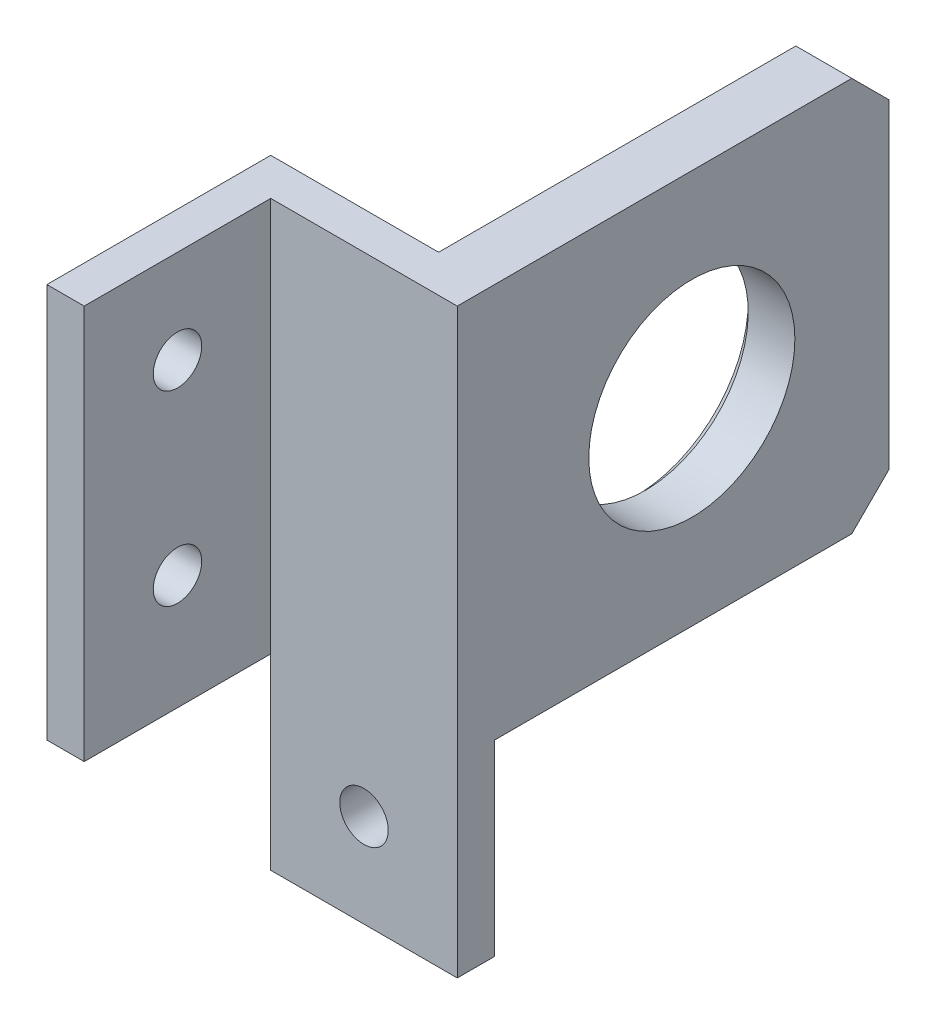
ISO-10303-21;
HEADER;
FILE_DESCRIPTION(('STEP AP214'),'2;1');
FILE_NAME('part.step','',(''),(''),'','','');
FILE_SCHEMA(('AUTOMOTIVE_DESIGN { 1 0 10303 214 1 1 1 1 }'));
ENDSEC;
DATA;
#1=APPLICATION_CONTEXT('core data for automotive mechanical design processes');
#2=APPLICATION_PROTOCOL_DEFINITION('international standard','automotive_design',2000,#1);
#3=PRODUCT_CONTEXT('',#1,'mechanical');
#4=PRODUCT('Part','Part','',(#3));
#5=PRODUCT_RELATED_PRODUCT_CATEGORY('part','',(#4));
#6=PRODUCT_DEFINITION_FORMATION('','',#4);
#7=PRODUCT_DEFINITION_CONTEXT('part definition',#1,'design');
#8=PRODUCT_DEFINITION('design','',#6,#7);
#9=PRODUCT_DEFINITION_SHAPE('','',#8);
#10=(LENGTH_UNIT() NAMED_UNIT(*) SI_UNIT(.MILLI.,.METRE.));
#11=(NAMED_UNIT(*) PLANE_ANGLE_UNIT() SI_UNIT($,.RADIAN.));
#12=(NAMED_UNIT(*) SI_UNIT($,.STERADIAN.) SOLID_ANGLE_UNIT());
#13=UNCERTAINTY_MEASURE_WITH_UNIT(LENGTH_MEASURE(1.E-05),#10,'distance_accuracy_value','');
#14=(GEOMETRIC_REPRESENTATION_CONTEXT(3) GLOBAL_UNCERTAINTY_ASSIGNED_CONTEXT((#13)) GLOBAL_UNIT_ASSIGNED_CONTEXT((#10,
#11,#12)) REPRESENTATION_CONTEXT('',''));
#15=CARTESIAN_POINT('',(0.,0.,0.));
#16=DIRECTION('',(0.,0.,1.));
#17=DIRECTION('',(1.,0.,0.));
#18=AXIS2_PLACEMENT_3D('',#15,#16,#17);
#19=CARTESIAN_POINT('',(-4.52428779759901,-82.2999999999999,-44.0000000000001));
#20=DIRECTION('',(0.,1.,0.));
#21=DIRECTION('',(-1.,0.,0.));
#22=AXIS2_PLACEMENT_3D('',#19,#20,#21);
#23=PLANE('',#22);
#24=DIRECTION('',(0.,0.,1.));
#25=VECTOR('',#24,1.);
#26=CARTESIAN_POINT('',(-24.5242877975988,-82.2999999999999,-40.0000000000001));
#27=LINE('',#26,#25);
#28=CARTESIAN_POINT('',(-24.5242877975988,-82.2999999999999,-44.0000000000001));
#29=VERTEX_POINT('',#28);
#30=CARTESIAN_POINT('',(-24.5242877975988,-82.2999999999999,-40.0000000000001));
#31=VERTEX_POINT('',#30);
#32=EDGE_CURVE('E238',#29,#31,#27,.T.);
#33=ORIENTED_EDGE('',*,*,#32,.T.);
#34=DIRECTION('',(0.,0.,-1.));
#35=VECTOR('',#34,1.);
#36=CARTESIAN_POINT('',(-24.5242877975988,-82.2999999999999,-44.0000000000001));
#37=LINE('',#36,#35);
#38=CARTESIAN_POINT('',(-24.5242877975988,-82.2999999999999,-20.0000000000001));
#39=VERTEX_POINT('',#38);
#40=EDGE_CURVE('E158',#39,#31,#37,.T.);
#41=ORIENTED_EDGE('',*,*,#40,.F.);
#42=DIRECTION('',(1.,0.,0.));
#43=VECTOR('',#42,1.);
#44=CARTESIAN_POINT('',(-28.5242877975988,-82.2999999999999,-20.0000000000001));
#45=LINE('',#44,#43);
#46=CARTESIAN_POINT('',(-28.5242877975988,-82.2999999999999,-20.0000000000001));
#47=VERTEX_POINT('',#46);
#48=EDGE_CURVE('E166',#47,#39,#45,.T.);
#49=ORIENTED_EDGE('',*,*,#48,.F.);
#50=DIRECTION('',(0.,0.,-1.));
#51=VECTOR('',#50,1.);
#52=CARTESIAN_POINT('',(-28.5242877975988,-82.2999999999999,-44.0000000000001));
#53=LINE('',#52,#51);
#54=CARTESIAN_POINT('',(-28.5242877975988,-82.2999999999999,-44.0000000000001));
#55=VERTEX_POINT('',#54);
#56=EDGE_CURVE('E163',#47,#55,#53,.T.);
#57=ORIENTED_EDGE('',*,*,#56,.T.);
#58=DIRECTION('',(1.,0.,0.));
#59=VECTOR('',#58,1.);
#60=CARTESIAN_POINT('',(-4.52428779759901,-82.2999999999999,-44.0000000000001));
#61=LINE('',#60,#59);
#62=EDGE_CURVE('E183',#55,#29,#61,.T.);
#63=ORIENTED_EDGE('',*,*,#62,.T.);
#64=EDGE_LOOP('',(#33,#41,#49,#57,#63));
#65=FACE_BOUND('',#64,.T.);
#66=ADVANCED_FACE('F33',(#65),#23,.F.);
#67=DIRECTION('',(0.,0.,1.));
#68=VECTOR('',#67,1.);
#69=CARTESIAN_POINT('',(-4.52428779759901,-82.2999999999999,-44.0000000000001));
#70=LINE('',#69,#68);
#71=CARTESIAN_POINT('',(-4.52428779759902,-82.2999999999999,-82.3000000000004));
#72=VERTEX_POINT('',#71);
#73=CARTESIAN_POINT('',(-4.52428779759901,-82.2999999999999,-44.0000000000001));
#74=VERTEX_POINT('',#73);
#75=EDGE_CURVE('E187',#72,#74,#70,.T.);
#76=ORIENTED_EDGE('',*,*,#75,.T.);
#77=DIRECTION('',(-1.,0.,0.));
#78=VECTOR('',#77,1.);
#79=CARTESIAN_POINT('',(-4.52428779759901,-82.2999999999999,-44.0000000000001));
#80=LINE('',#79,#78);
#81=CARTESIAN_POINT('',(-10.524287797599,-82.2999999999999,-44.0000000000001));
#82=VERTEX_POINT('',#81);
#83=EDGE_CURVE('E241',#74,#82,#80,.T.);
#84=ORIENTED_EDGE('',*,*,#83,.T.);
#85=DIRECTION('',(0.,0.,1.));
#86=VECTOR('',#85,1.);
#87=CARTESIAN_POINT('',(-10.524287797599,-82.2999999999999,-129.023412785029));
#88=LINE('',#87,#86);
#89=CARTESIAN_POINT('',(-10.524287797599,-82.2999999999999,-82.3000000000004));
#90=VERTEX_POINT('',#89);
#91=EDGE_CURVE('E146',#90,#82,#88,.T.);
#92=ORIENTED_EDGE('',*,*,#91,.F.);
#93=DIRECTION('',(-1.,0.,0.));
#94=VECTOR('',#93,1.);
#95=CARTESIAN_POINT('',(69.475712202401,-82.2999999999999,-82.3000000000004));
#96=LINE('',#95,#94);
#97=EDGE_CURVE('E128',#72,#90,#96,.T.);
#98=ORIENTED_EDGE('',*,*,#97,.F.);
#99=EDGE_LOOP('',(#76,#84,#92,#98));
#100=FACE_BOUND('',#99,.T.);
#101=ADVANCED_FACE('F262',(#100),#23,.F.);
#102=CARTESIAN_POINT('',(0.,0.,-44.0000000000001));
#103=DIRECTION('',(0.,0.,1.));
#104=DIRECTION('',(-1.,0.,0.));
#105=AXIS2_PLACEMENT_3D('',#102,#103,#104);
#106=PLANE('',#105);
#107=CARTESIAN_POINT('',(-14.524287797599,-92.3915967434677,-44.0000000000001));
#108=DIRECTION('',(0.,0.,1.));
#109=DIRECTION('',(1.,0.,0.));
#110=AXIS2_PLACEMENT_3D('',#107,#108,#109);
#111=CIRCLE('',#110,2.6);
#112=CARTESIAN_POINT('',(-11.924287797599,-92.3915967434677,-44.0000000000001));
#113=VERTEX_POINT('',#112);
#114=EDGE_CURVE('E251',#113,#113,#111,.T.);
#115=ORIENTED_EDGE('',*,*,#114,.T.);
#116=EDGE_LOOP('',(#115));
#117=FACE_BOUND('',#116,.T.);
#118=DIRECTION('',(0.,-1.,0.));
#119=VECTOR('',#118,1.);
#120=CARTESIAN_POINT('',(-10.524287797599,-40.,-44.0000000000001));
#121=LINE('',#120,#119);
#122=CARTESIAN_POINT('',(-10.524287797599,-40.,-44.0000000000001));
#123=VERTEX_POINT('',#122);
#124=EDGE_CURVE('E143',#123,#82,#121,.T.);
#125=ORIENTED_EDGE('',*,*,#124,.T.);
#126=ORIENTED_EDGE('',*,*,#83,.F.);
#127=DIRECTION('',(0.,1.,0.));
#128=VECTOR('',#127,1.);
#129=CARTESIAN_POINT('',(-4.52428779759904,-122.787674797839,-44.0000000000001));
#130=LINE('',#129,#128);
#131=CARTESIAN_POINT('',(-4.52428779759901,-102.391596743468,-44.0000000000001));
#132=VERTEX_POINT('',#131);
#133=EDGE_CURVE('E232',#132,#74,#130,.T.);
#134=ORIENTED_EDGE('',*,*,#133,.F.);
#135=DIRECTION('',(1.,0.,0.));
#136=VECTOR('',#135,1.);
#137=CARTESIAN_POINT('',(-4.52428779759903,-102.391596743468,-44.0000000000001));
#138=LINE('',#137,#136);
#139=CARTESIAN_POINT('',(-24.5242877975988,-102.391596743468,-44.0000000000001));
#140=VERTEX_POINT('',#139);
#141=EDGE_CURVE('E247',#140,#132,#138,.T.);
#142=ORIENTED_EDGE('',*,*,#141,.F.);
#143=DIRECTION('',(0.,1.,0.));
#144=VECTOR('',#143,1.);
#145=CARTESIAN_POINT('',(-24.5242877975989,-122.787674797839,-44.0000000000001));
#146=LINE('',#145,#144);
#147=EDGE_CURVE('E234',#140,#29,#146,.T.);
#148=ORIENTED_EDGE('',*,*,#147,.T.);
#149=ORIENTED_EDGE('',*,*,#62,.F.);
#150=DIRECTION('',(0.,1.,0.));
#151=VECTOR('',#150,1.);
#152=CARTESIAN_POINT('',(-28.5242877975987,-40.,-44.0000000000001));
#153=LINE('',#152,#151);
#154=CARTESIAN_POINT('',(-28.5242877975987,-40.,-44.0000000000001));
#155=VERTEX_POINT('',#154);
#156=EDGE_CURVE('E154',#55,#155,#153,.T.);
#157=ORIENTED_EDGE('',*,*,#156,.T.);
#158=DIRECTION('',(-1.,0.,0.));
#159=VECTOR('',#158,1.);
#160=CARTESIAN_POINT('',(-4.52428779759901,-40.,-44.0000000000001));
#161=LINE('',#160,#159);
#162=EDGE_CURVE('E181',#123,#155,#161,.T.);
#163=ORIENTED_EDGE('',*,*,#162,.F.);
#164=EDGE_LOOP('',(#125,#126,#134,#142,#148,#149,#157,#163));
#165=FACE_BOUND('',#164,.T.);
#166=ADVANCED_FACE('F269',(#117,#165),#106,.F.);
#167=CARTESIAN_POINT('',(-4.52428779759901,-40.,-44.0000000000001));
#168=DIRECTION('',(-1.,0.,0.));
#169=DIRECTION('',(0.,-1.,0.));
#170=AXIS2_PLACEMENT_3D('',#167,#168,#169);
#171=PLANE('',#170);
#172=CARTESIAN_POINT('',(-4.52428779759902,-61.15,-65.15));
#173=DIRECTION('',(-1.,0.,0.));
#174=DIRECTION('',(0.,0.,1.));
#175=AXIS2_PLACEMENT_3D('',#172,#173,#174);
#176=CIRCLE('',#175,11.05);
#177=CARTESIAN_POINT('',(-4.52428779759902,-61.15,-54.1));
#178=VERTEX_POINT('',#177);
#179=EDGE_CURVE('E144',#178,#178,#176,.T.);
#180=ORIENTED_EDGE('',*,*,#179,.T.);
#181=EDGE_LOOP('',(#180));
#182=FACE_BOUND('',#181,.T.);
#183=DIRECTION('',(0.,0.,1.));
#184=VECTOR('',#183,1.);
#185=CARTESIAN_POINT('',(-4.52428779759901,-40.,-44.0000000000001));
#186=LINE('',#185,#184);
#187=CARTESIAN_POINT('',(-4.52428779759902,-40.,-82.3000000000003));
#188=VERTEX_POINT('',#187);
#189=CARTESIAN_POINT('',(-4.52428779759901,-40.,-40.0000000000001));
#190=VERTEX_POINT('',#189);
#191=EDGE_CURVE('E137',#188,#190,#186,.T.);
#192=ORIENTED_EDGE('',*,*,#191,.T.);
#193=DIRECTION('',(0.,1.,0.));
#194=VECTOR('',#193,1.);
#195=CARTESIAN_POINT('',(-4.52428779759901,-40.,-40.0000000000001));
#196=LINE('',#195,#194);
#197=CARTESIAN_POINT('',(-4.52428779759901,-102.391596743468,-40.0000000000001));
#198=VERTEX_POINT('',#197);
#199=EDGE_CURVE('E180',#198,#190,#196,.T.);
#200=ORIENTED_EDGE('',*,*,#199,.F.);
#201=DIRECTION('',(0.,0.,1.));
#202=VECTOR('',#201,1.);
#203=CARTESIAN_POINT('',(-4.52428779759902,-102.391596743468,-40.0000000000001));
#204=LINE('',#203,#202);
#205=EDGE_CURVE('E220',#132,#198,#204,.T.);
#206=ORIENTED_EDGE('',*,*,#205,.F.);
#207=ORIENTED_EDGE('',*,*,#133,.T.);
#208=ORIENTED_EDGE('',*,*,#75,.F.);
#209=DIRECTION('',(0.,-0.707106781186545,0.70710678118655));
#210=VECTOR('',#209,1.);
#211=CARTESIAN_POINT('',(-4.52428779759901,-80.3000000000002,-84.3000000000001));
#212=LINE('',#211,#210);
#213=CARTESIAN_POINT('',(-4.52428779759901,-78.3000000000002,-86.3000000000001));
#214=VERTEX_POINT('',#213);
#215=EDGE_CURVE('E138',#214,#72,#212,.T.);
#216=ORIENTED_EDGE('',*,*,#215,.F.);
#217=DIRECTION('',(0.,1.,0.));
#218=VECTOR('',#217,1.);
#219=CARTESIAN_POINT('',(-4.52428779759901,-40.,-86.3000000000001));
#220=LINE('',#219,#218);
#221=CARTESIAN_POINT('',(-4.524287797599,-43.9999999999998,-86.3000000000001));
#222=VERTEX_POINT('',#221);
#223=EDGE_CURVE('E171',#214,#222,#220,.T.);
#224=ORIENTED_EDGE('',*,*,#223,.T.);
#225=DIRECTION('',(0.,-0.707106781186549,-0.707106781186546));
#226=VECTOR('',#225,1.);
#227=CARTESIAN_POINT('',(-4.52428779759902,-20.8499999999999,-63.1500000000003));
#228=LINE('',#227,#226);
#229=EDGE_CURVE('E254',#188,#222,#228,.T.);
#230=ORIENTED_EDGE('',*,*,#229,.F.);
#231=EDGE_LOOP('',(#192,#200,#206,#207,#208,#216,#224,#230));
#232=FACE_BOUND('',#231,.T.);
#233=ADVANCED_FACE('F263',(#182,#232),#171,.F.);
#234=CARTESIAN_POINT('',(-4.52428779759901,-40.,-44.0000000000001));
#235=DIRECTION('',(0.,-1.,0.));
#236=DIRECTION('',(0.,0.,1.));
#237=AXIS2_PLACEMENT_3D('',#234,#235,#236);
#238=PLANE('',#237);
#239=DIRECTION('',(0.,0.,1.));
#240=VECTOR('',#239,1.);
#241=CARTESIAN_POINT('',(-10.524287797599,-40.,-129.023412785029));
#242=LINE('',#241,#240);
#243=CARTESIAN_POINT('',(-10.524287797599,-40.,-82.3000000000003));
#244=VERTEX_POINT('',#243);
#245=EDGE_CURVE('E134',#244,#123,#242,.T.);
#246=ORIENTED_EDGE('',*,*,#245,.T.);
#247=ORIENTED_EDGE('',*,*,#162,.T.);
#248=DIRECTION('',(0.,0.,1.));
#249=VECTOR('',#248,1.);
#250=CARTESIAN_POINT('',(-28.5242877975987,-40.,-44.0000000000001));
#251=LINE('',#250,#249);
#252=CARTESIAN_POINT('',(-28.5242877975987,-40.,-20.0000000000001));
#253=VERTEX_POINT('',#252);
#254=EDGE_CURVE('E157',#155,#253,#251,.T.);
#255=ORIENTED_EDGE('',*,*,#254,.T.);
#256=DIRECTION('',(1.,0.,0.));
#257=VECTOR('',#256,1.);
#258=CARTESIAN_POINT('',(-28.5242877975987,-40.,-20.0000000000001));
#259=LINE('',#258,#257);
#260=CARTESIAN_POINT('',(-24.5242877975987,-40.,-20.0000000000001));
#261=VERTEX_POINT('',#260);
#262=EDGE_CURVE('E177',#253,#261,#259,.T.);
#263=ORIENTED_EDGE('',*,*,#262,.T.);
#264=DIRECTION('',(0.,0.,1.));
#265=VECTOR('',#264,1.);
#266=CARTESIAN_POINT('',(-24.5242877975987,-40.,-44.0000000000001));
#267=LINE('',#266,#265);
#268=CARTESIAN_POINT('',(-24.5242877975987,-40.,-40.0000000000001));
#269=VERTEX_POINT('',#268);
#270=EDGE_CURVE('E167',#269,#261,#267,.T.);
#271=ORIENTED_EDGE('',*,*,#270,.F.);
#272=DIRECTION('',(-1.,0.,0.));
#273=VECTOR('',#272,1.);
#274=CARTESIAN_POINT('',(-4.52428779759901,-40.,-40.0000000000001));
#275=LINE('',#274,#273);
#276=EDGE_CURVE('E190',#190,#269,#275,.T.);
#277=ORIENTED_EDGE('',*,*,#276,.F.);
#278=ORIENTED_EDGE('',*,*,#191,.F.);
#279=DIRECTION('',(-1.,0.,0.));
#280=VECTOR('',#279,1.);
#281=CARTESIAN_POINT('',(69.475712202401,-40.,-82.3000000000003));
#282=LINE('',#281,#280);
#283=EDGE_CURVE('E122',#188,#244,#282,.T.);
#284=ORIENTED_EDGE('',*,*,#283,.T.);
#285=EDGE_LOOP('',(#246,#247,#255,#263,#271,#277,#278,#284));
#286=FACE_BOUND('',#285,.T.);
#287=ADVANCED_FACE('F132',(#286),#238,.F.);
#288=CARTESIAN_POINT('',(0.,0.,-40.0000000000001));
#289=DIRECTION('',(0.,0.,1.));
#290=DIRECTION('',(-1.,0.,0.));
#291=AXIS2_PLACEMENT_3D('',#288,#289,#290);
#292=PLANE('',#291);
#293=CARTESIAN_POINT('',(-14.524287797599,-92.3915967434677,-40.0000000000001));
#294=DIRECTION('',(0.,0.,1.));
#295=DIRECTION('',(1.,0.,0.));
#296=AXIS2_PLACEMENT_3D('',#293,#294,#295);
#297=CIRCLE('',#296,2.6);
#298=CARTESIAN_POINT('',(-11.924287797599,-92.3915967434677,-40.0000000000001));
#299=VERTEX_POINT('',#298);
#300=EDGE_CURVE('E244',#299,#299,#297,.T.);
#301=ORIENTED_EDGE('',*,*,#300,.F.);
#302=EDGE_LOOP('',(#301));
#303=FACE_BOUND('',#302,.T.);
#304=ORIENTED_EDGE('',*,*,#199,.T.);
#305=ORIENTED_EDGE('',*,*,#276,.T.);
#306=DIRECTION('',(0.,-1.,0.));
#307=VECTOR('',#306,1.);
#308=CARTESIAN_POINT('',(-24.5242877975987,-40.,-40.0000000000001));
#309=LINE('',#308,#307);
#310=EDGE_CURVE('E184',#269,#31,#309,.T.);
#311=ORIENTED_EDGE('',*,*,#310,.T.);
#312=DIRECTION('',(0.,1.,0.));
#313=VECTOR('',#312,1.);
#314=CARTESIAN_POINT('',(-24.5242877975989,-122.787674797839,-40.0000000000001));
#315=LINE('',#314,#313);
#316=CARTESIAN_POINT('',(-24.5242877975988,-102.391596743468,-40.0000000000001));
#317=VERTEX_POINT('',#316);
#318=EDGE_CURVE('E236',#317,#31,#315,.T.);
#319=ORIENTED_EDGE('',*,*,#318,.F.);
#320=DIRECTION('',(-1.,0.,0.));
#321=VECTOR('',#320,1.);
#322=CARTESIAN_POINT('',(-4.52428779759903,-102.391596743468,-40.0000000000001));
#323=LINE('',#322,#321);
#324=EDGE_CURVE('E228',#198,#317,#323,.T.);
#325=ORIENTED_EDGE('',*,*,#324,.F.);
#326=EDGE_LOOP('',(#304,#305,#311,#319,#325));
#327=FACE_BOUND('',#326,.T.);
#328=ADVANCED_FACE('F283',(#303,#327),#292,.T.);
#329=CARTESIAN_POINT('',(-28.5242877975987,-40.,-20.0000000000001));
#330=DIRECTION('',(0.,0.,-1.));
#331=DIRECTION('',(0.,-1.,0.));
#332=AXIS2_PLACEMENT_3D('',#329,#330,#331);
#333=PLANE('',#332);
#334=DIRECTION('',(0.,-1.,0.));
#335=VECTOR('',#334,1.);
#336=CARTESIAN_POINT('',(-24.5242877975987,-40.,-20.0000000000001));
#337=LINE('',#336,#335);
#338=EDGE_CURVE('E170',#261,#39,#337,.T.);
#339=ORIENTED_EDGE('',*,*,#338,.F.);
#340=ORIENTED_EDGE('',*,*,#262,.F.);
#341=DIRECTION('',(0.,-1.,0.));
#342=VECTOR('',#341,1.);
#343=CARTESIAN_POINT('',(-28.5242877975987,-40.,-20.0000000000001));
#344=LINE('',#343,#342);
#345=EDGE_CURVE('E161',#253,#47,#344,.T.);
#346=ORIENTED_EDGE('',*,*,#345,.T.);
#347=ORIENTED_EDGE('',*,*,#48,.T.);
#348=EDGE_LOOP('',(#339,#340,#346,#347));
#349=FACE_BOUND('',#348,.T.);
#350=ADVANCED_FACE('F278',(#349),#333,.F.);
#351=CARTESIAN_POINT('',(-28.5242877975987,0.,-40.0000000000001));
#352=DIRECTION('',(1.,0.,0.));
#353=DIRECTION('',(0.,1.,0.));
#354=AXIS2_PLACEMENT_3D('',#351,#352,#353);
#355=PLANE('',#354);
#356=CARTESIAN_POINT('',(-28.5242877975988,-50.,-30.0000000000001));
#357=DIRECTION('',(1.,0.,0.));
#358=DIRECTION('',(0.,-1.,0.));
#359=AXIS2_PLACEMENT_3D('',#356,#357,#358);
#360=CIRCLE('',#359,2.6);
#361=CARTESIAN_POINT('',(-28.5242877975988,-52.6,-30.0000000000001));
#362=VERTEX_POINT('',#361);
#363=EDGE_CURVE('E223',#362,#362,#360,.T.);
#364=ORIENTED_EDGE('',*,*,#363,.T.);
#365=EDGE_LOOP('',(#364));
#366=FACE_BOUND('',#365,.T.);
#367=CARTESIAN_POINT('',(-28.5242877975988,-70.,-30.0000000000003));
#368=DIRECTION('',(1.,0.,0.));
#369=DIRECTION('',(0.,-1.,0.));
#370=AXIS2_PLACEMENT_3D('',#367,#368,#369);
#371=CIRCLE('',#370,2.6);
#372=CARTESIAN_POINT('',(-28.5242877975988,-72.6,-30.0000000000003));
#373=VERTEX_POINT('',#372);
#374=EDGE_CURVE('E216',#373,#373,#371,.T.);
#375=ORIENTED_EDGE('',*,*,#374,.T.);
#376=EDGE_LOOP('',(#375));
#377=FACE_BOUND('',#376,.T.);
#378=ORIENTED_EDGE('',*,*,#156,.F.);
#379=ORIENTED_EDGE('',*,*,#56,.F.);
#380=ORIENTED_EDGE('',*,*,#345,.F.);
#381=ORIENTED_EDGE('',*,*,#254,.F.);
#382=EDGE_LOOP('',(#378,#379,#380,#381));
#383=FACE_BOUND('',#382,.T.);
#384=ADVANCED_FACE('F274',(#366,#377,#383),#355,.F.);
#385=CARTESIAN_POINT('',(-24.5242877975987,0.,-40.0000000000001));
#386=DIRECTION('',(1.,0.,0.));
#387=DIRECTION('',(0.,1.,0.));
#388=AXIS2_PLACEMENT_3D('',#385,#386,#387);
#389=PLANE('',#388);
#390=CARTESIAN_POINT('',(-24.5242877975988,-50.,-30.0000000000001));
#391=DIRECTION('',(1.,0.,0.));
#392=DIRECTION('',(0.,-1.,0.));
#393=AXIS2_PLACEMENT_3D('',#390,#391,#392);
#394=CIRCLE('',#393,2.6);
#395=CARTESIAN_POINT('',(-24.5242877975988,-52.6,-30.0000000000001));
#396=VERTEX_POINT('',#395);
#397=EDGE_CURVE('E149',#396,#396,#394,.T.);
#398=ORIENTED_EDGE('',*,*,#397,.F.);
#399=EDGE_LOOP('',(#398));
#400=FACE_BOUND('',#399,.T.);
#401=CARTESIAN_POINT('',(-24.5242877975988,-70.,-30.0000000000003));
#402=DIRECTION('',(1.,0.,0.));
#403=DIRECTION('',(0.,-1.,0.));
#404=AXIS2_PLACEMENT_3D('',#401,#402,#403);
#405=CIRCLE('',#404,2.6);
#406=CARTESIAN_POINT('',(-24.5242877975988,-72.6,-30.0000000000003));
#407=VERTEX_POINT('',#406);
#408=EDGE_CURVE('E219',#407,#407,#405,.T.);
#409=ORIENTED_EDGE('',*,*,#408,.F.);
#410=EDGE_LOOP('',(#409));
#411=FACE_BOUND('',#410,.T.);
#412=ORIENTED_EDGE('',*,*,#270,.T.);
#413=ORIENTED_EDGE('',*,*,#338,.T.);
#414=ORIENTED_EDGE('',*,*,#40,.T.);
#415=ORIENTED_EDGE('',*,*,#310,.F.);
#416=EDGE_LOOP('',(#412,#413,#414,#415));
#417=FACE_BOUND('',#416,.T.);
#418=ADVANCED_FACE('F281',(#400,#411,#417),#389,.T.);
#419=CARTESIAN_POINT('',(-10.524287797599,-40.,-129.023412785029));
#420=DIRECTION('',(1.,0.,0.));
#421=DIRECTION('',(0.,1.,0.));
#422=AXIS2_PLACEMENT_3D('',#419,#420,#421);
#423=PLANE('',#422);
#424=CARTESIAN_POINT('',(-10.524287797599,-61.15,-65.15));
#425=DIRECTION('',(-1.,0.,0.));
#426=DIRECTION('',(0.,1.,0.));
#427=AXIS2_PLACEMENT_3D('',#424,#425,#426);
#428=CIRCLE('',#427,12.05);
#429=CARTESIAN_POINT('',(-10.524287797599,-49.1,-65.15));
#430=VERTEX_POINT('',#429);
#431=EDGE_CURVE('E198',#430,#430,#428,.T.);
#432=ORIENTED_EDGE('',*,*,#431,.F.);
#433=EDGE_LOOP('',(#432));
#434=FACE_BOUND('',#433,.T.);
#435=DIRECTION('',(0.,-1.,0.));
#436=VECTOR('',#435,1.);
#437=CARTESIAN_POINT('',(-10.524287797599,-40.,-86.3000000000001));
#438=LINE('',#437,#436);
#439=CARTESIAN_POINT('',(-10.524287797599,-43.9999999999998,-86.3000000000001));
#440=VERTEX_POINT('',#439);
#441=CARTESIAN_POINT('',(-10.524287797599,-78.3000000000002,-86.3000000000001));
#442=VERTEX_POINT('',#441);
#443=EDGE_CURVE('E205',#440,#442,#438,.T.);
#444=ORIENTED_EDGE('',*,*,#443,.T.);
#445=DIRECTION('',(0.,-0.707106781186546,0.70710678118655));
#446=VECTOR('',#445,1.);
#447=CARTESIAN_POINT('',(-10.524287797599,-82.2999999999999,-82.3000000000004));
#448=LINE('',#447,#446);
#449=EDGE_CURVE('E209',#442,#90,#448,.T.);
#450=ORIENTED_EDGE('',*,*,#449,.T.);
#451=ORIENTED_EDGE('',*,*,#91,.T.);
#452=ORIENTED_EDGE('',*,*,#124,.F.);
#453=ORIENTED_EDGE('',*,*,#245,.F.);
#454=DIRECTION('',(0.,-0.707106781186549,-0.707106781186546));
#455=VECTOR('',#454,1.);
#456=CARTESIAN_POINT('',(-10.524287797599,-43.9999999999998,-86.3000000000001));
#457=LINE('',#456,#455);
#458=EDGE_CURVE('E119',#244,#440,#457,.T.);
#459=ORIENTED_EDGE('',*,*,#458,.T.);
#460=EDGE_LOOP('',(#444,#450,#451,#452,#453,#459));
#461=FACE_BOUND('',#460,.T.);
#462=ADVANCED_FACE('F141',(#434,#461),#423,.F.);
#463=CARTESIAN_POINT('',(-385.324287797599,-43.314,-86.3));
#464=DIRECTION('',(0.,0.,-1.));
#465=DIRECTION('',(0.,-1.,0.));
#466=AXIS2_PLACEMENT_3D('',#463,#464,#465);
#467=PLANE('',#466);
#468=DIRECTION('',(1.,0.,0.));
#469=VECTOR('',#468,1.);
#470=CARTESIAN_POINT('',(-385.324287797599,-43.9999999999998,-86.3));
#471=LINE('',#470,#469);
#472=EDGE_CURVE('E12',#440,#222,#471,.T.);
#473=ORIENTED_EDGE('',*,*,#472,.T.);
#474=ORIENTED_EDGE('',*,*,#223,.F.);
#475=DIRECTION('',(-1.,0.,0.));
#476=VECTOR('',#475,1.);
#477=CARTESIAN_POINT('',(-385.324287797599,-78.3000000000002,-86.3));
#478=LINE('',#477,#476);
#479=EDGE_CURVE('E41',#214,#442,#478,.T.);
#480=ORIENTED_EDGE('',*,*,#479,.T.);
#481=ORIENTED_EDGE('',*,*,#443,.F.);
#482=EDGE_LOOP('',(#473,#474,#480,#481));
#483=FACE_BOUND('',#482,.T.);
#484=ADVANCED_FACE('F204',(#483),#467,.T.);
#485=CARTESIAN_POINT('',(-11.524287797599,-61.15,-65.15));
#486=DIRECTION('',(1.,0.,0.));
#487=DIRECTION('',(0.,0.,1.));
#488=AXIS2_PLACEMENT_3D('',#485,#486,#487);
#489=CYLINDRICAL_SURFACE('',#488,11.05);
#490=CARTESIAN_POINT('',(-9.52428779759903,-61.15,-65.15));
#491=DIRECTION('',(-1.,0.,0.));
#492=DIRECTION('',(0.,0.,1.));
#493=AXIS2_PLACEMENT_3D('',#490,#491,#492);
#494=CIRCLE('',#493,11.05);
#495=CARTESIAN_POINT('',(-9.52428779759903,-61.15,-54.1));
#496=VERTEX_POINT('',#495);
#497=EDGE_CURVE('E201',#496,#496,#494,.F.);
#498=ORIENTED_EDGE('',*,*,#497,.F.);
#499=EDGE_LOOP('',(#498));
#500=FACE_BOUND('',#499,.T.);
#501=ORIENTED_EDGE('',*,*,#179,.F.);
#502=EDGE_LOOP('',(#501));
#503=FACE_BOUND('',#502,.T.);
#504=ADVANCED_FACE('F320',(#500,#503),#489,.F.);
#505=CARTESIAN_POINT('',(-24.5242877975988,-70.,-30.0000000000003));
#506=DIRECTION('',(-1.,0.,0.));
#507=DIRECTION('',(0.,-1.,0.));
#508=AXIS2_PLACEMENT_3D('',#505,#506,#507);
#509=CYLINDRICAL_SURFACE('',#508,2.6);
#510=ORIENTED_EDGE('',*,*,#408,.T.);
#511=EDGE_LOOP('',(#510));
#512=FACE_BOUND('',#511,.T.);
#513=ORIENTED_EDGE('',*,*,#374,.F.);
#514=EDGE_LOOP('',(#513));
#515=FACE_BOUND('',#514,.T.);
#516=ADVANCED_FACE('F322',(#512,#515),#509,.F.);
#517=CARTESIAN_POINT('',(-24.5242877975988,-50.,-30.0000000000001));
#518=DIRECTION('',(-1.,0.,0.));
#519=DIRECTION('',(0.,-1.,0.));
#520=AXIS2_PLACEMENT_3D('',#517,#518,#519);
#521=CYLINDRICAL_SURFACE('',#520,2.6);
#522=ORIENTED_EDGE('',*,*,#397,.T.);
#523=EDGE_LOOP('',(#522));
#524=FACE_BOUND('',#523,.T.);
#525=ORIENTED_EDGE('',*,*,#363,.F.);
#526=EDGE_LOOP('',(#525));
#527=FACE_BOUND('',#526,.T.);
#528=ADVANCED_FACE('F300',(#524,#527),#521,.F.);
#529=CARTESIAN_POINT('',(-10.524287797599,-61.15,-65.15));
#530=DIRECTION('',(-1.,0.,0.));
#531=DIRECTION('',(0.,0.,-1.));
#532=AXIS2_PLACEMENT_3D('',#529,#530,#531);
#533=CONICAL_SURFACE('',#532,12.05,0.785398163397442);
#534=ORIENTED_EDGE('',*,*,#497,.T.);
#535=EDGE_LOOP('',(#534));
#536=FACE_BOUND('',#535,.T.);
#537=ORIENTED_EDGE('',*,*,#431,.T.);
#538=EDGE_LOOP('',(#537));
#539=FACE_BOUND('',#538,.T.);
#540=ADVANCED_FACE('F35',(#536,#539),#533,.F.);
#541=CARTESIAN_POINT('',(-24.5242877975989,-122.787674797839,-40.0000000000001));
#542=DIRECTION('',(1.,0.,0.));
#543=DIRECTION('',(0.,1.,0.));
#544=AXIS2_PLACEMENT_3D('',#541,#542,#543);
#545=PLANE('',#544);
#546=ORIENTED_EDGE('',*,*,#318,.T.);
#547=ORIENTED_EDGE('',*,*,#32,.F.);
#548=ORIENTED_EDGE('',*,*,#147,.F.);
#549=DIRECTION('',(0.,0.,-1.));
#550=VECTOR('',#549,1.);
#551=CARTESIAN_POINT('',(-24.5242877975988,-102.391596743468,-40.0000000000001));
#552=LINE('',#551,#550);
#553=EDGE_CURVE('E231',#317,#140,#552,.T.);
#554=ORIENTED_EDGE('',*,*,#553,.F.);
#555=EDGE_LOOP('',(#546,#547,#548,#554));
#556=FACE_BOUND('',#555,.T.);
#557=ADVANCED_FACE('F291',(#556),#545,.F.);
#558=CARTESIAN_POINT('',(-360.524287797599,-102.391596743468,-20.));
#559=DIRECTION('',(0.,1.,0.));
#560=DIRECTION('',(-1.,0.,0.));
#561=AXIS2_PLACEMENT_3D('',#558,#559,#560);
#562=PLANE('',#561);
#563=ORIENTED_EDGE('',*,*,#141,.T.);
#564=ORIENTED_EDGE('',*,*,#205,.T.);
#565=ORIENTED_EDGE('',*,*,#324,.T.);
#566=ORIENTED_EDGE('',*,*,#553,.T.);
#567=EDGE_LOOP('',(#563,#564,#565,#566));
#568=FACE_BOUND('',#567,.T.);
#569=ADVANCED_FACE('F286',(#568),#562,.F.);
#570=CARTESIAN_POINT('',(-14.524287797599,-92.3915967434677,-40.0000000000001));
#571=DIRECTION('',(0.,0.,-1.));
#572=DIRECTION('',(1.,0.,0.));
#573=AXIS2_PLACEMENT_3D('',#570,#571,#572);
#574=CYLINDRICAL_SURFACE('',#573,2.6);
#575=ORIENTED_EDGE('',*,*,#300,.T.);
#576=EDGE_LOOP('',(#575));
#577=FACE_BOUND('',#576,.T.);
#578=ORIENTED_EDGE('',*,*,#114,.F.);
#579=EDGE_LOOP('',(#578));
#580=FACE_BOUND('',#579,.T.);
#581=ADVANCED_FACE('F298',(#577,#580),#574,.F.);
#582=CARTESIAN_POINT('',(69.475712202401,-82.2999999999999,-82.3000000000004));
#583=DIRECTION('',(0.,0.70710678118655,0.707106781186545));
#584=DIRECTION('',(0.,0.707106781186545,-0.70710678118655));
#585=AXIS2_PLACEMENT_3D('',#582,#583,#584);
#586=PLANE('',#585);
#587=ORIENTED_EDGE('',*,*,#479,.F.);
#588=ORIENTED_EDGE('',*,*,#215,.T.);
#589=ORIENTED_EDGE('',*,*,#97,.T.);
#590=ORIENTED_EDGE('',*,*,#449,.F.);
#591=EDGE_LOOP('',(#587,#588,#589,#590));
#592=FACE_BOUND('',#591,.T.);
#593=ADVANCED_FACE('F210',(#592),#586,.F.);
#594=CARTESIAN_POINT('',(69.475712202401,-43.9999999999998,-86.3000000000001));
#595=DIRECTION('',(0.,-0.707106781186546,0.707106781186549));
#596=DIRECTION('',(0.,0.707106781186549,0.707106781186546));
#597=AXIS2_PLACEMENT_3D('',#594,#595,#596);
#598=PLANE('',#597);
#599=ORIENTED_EDGE('',*,*,#283,.F.);
#600=ORIENTED_EDGE('',*,*,#229,.T.);
#601=ORIENTED_EDGE('',*,*,#472,.F.);
#602=ORIENTED_EDGE('',*,*,#458,.F.);
#603=EDGE_LOOP('',(#599,#600,#601,#602));
#604=FACE_BOUND('',#603,.T.);
#605=ADVANCED_FACE('F121',(#604),#598,.F.);
#606=CLOSED_SHELL('',(#66,#101,#166,#233,#287,#328,#350,#384,#418,#462,#484,#504,#516,#528,#540,
#557,#569,#581,#593,#605));
#607=MANIFOLD_SOLID_BREP('B2',#606);
#608=ADVANCED_BREP_SHAPE_REPRESENTATION('',(#18,#607),#14);
#609=SHAPE_DEFINITION_REPRESENTATION(#9,#608);
ENDSEC;
END-ISO-10303-21;
